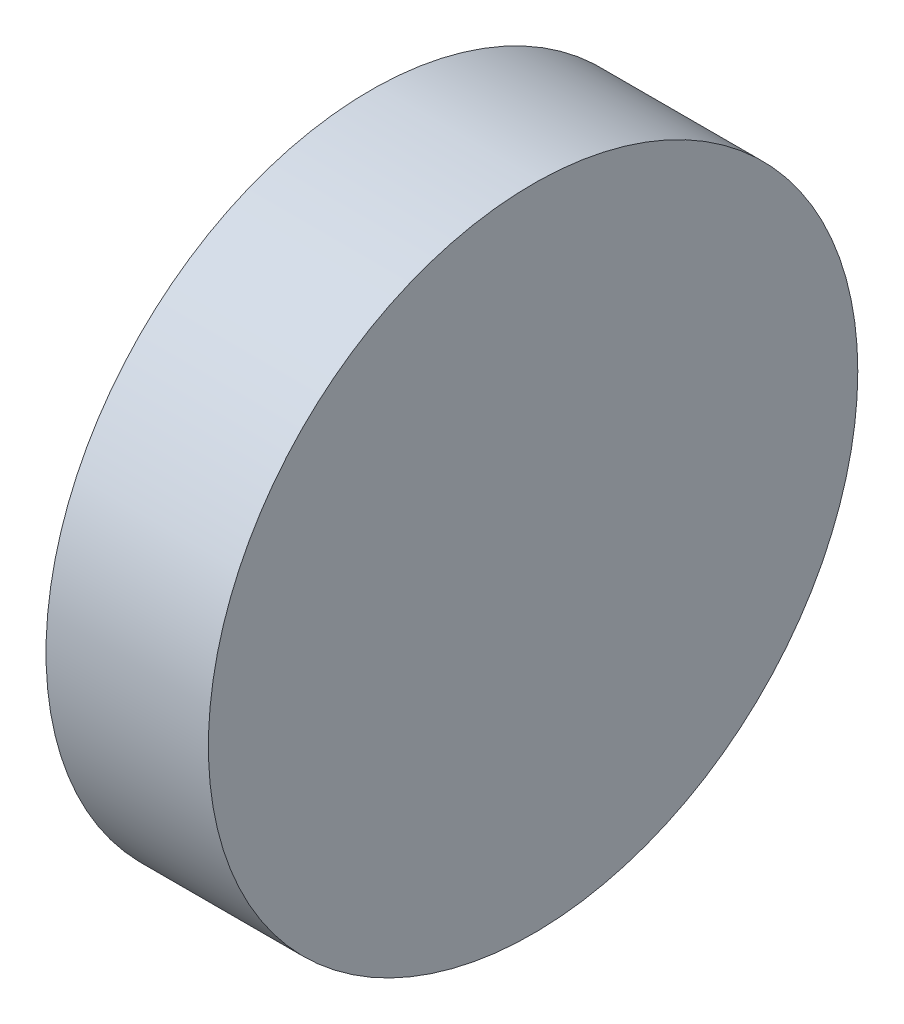
ISO-10303-21;
HEADER;
FILE_DESCRIPTION(('STEP AP214'),'2;1');
FILE_NAME('part.step','',(''),(''),'','','');
FILE_SCHEMA(('AUTOMOTIVE_DESIGN { 1 0 10303 214 1 1 1 1 }'));
ENDSEC;
DATA;
#1=APPLICATION_CONTEXT('core data for automotive mechanical design processes');
#2=APPLICATION_PROTOCOL_DEFINITION('international standard','automotive_design',2000,#1);
#3=PRODUCT_CONTEXT('',#1,'mechanical');
#4=PRODUCT('Part','Part','',(#3));
#5=PRODUCT_RELATED_PRODUCT_CATEGORY('part','',(#4));
#6=PRODUCT_DEFINITION_FORMATION('','',#4);
#7=PRODUCT_DEFINITION_CONTEXT('part definition',#1,'design');
#8=PRODUCT_DEFINITION('design','',#6,#7);
#9=PRODUCT_DEFINITION_SHAPE('','',#8);
#10=(LENGTH_UNIT() NAMED_UNIT(*) SI_UNIT(.MILLI.,.METRE.));
#11=(NAMED_UNIT(*) PLANE_ANGLE_UNIT() SI_UNIT($,.RADIAN.));
#12=(NAMED_UNIT(*) SI_UNIT($,.STERADIAN.) SOLID_ANGLE_UNIT());
#13=UNCERTAINTY_MEASURE_WITH_UNIT(LENGTH_MEASURE(1.E-05),#10,'distance_accuracy_value','');
#14=(GEOMETRIC_REPRESENTATION_CONTEXT(3) GLOBAL_UNCERTAINTY_ASSIGNED_CONTEXT((#13)) GLOBAL_UNIT_ASSIGNED_CONTEXT((#10,
#11,#12)) REPRESENTATION_CONTEXT('',''));
#15=CARTESIAN_POINT('',(0.,0.,0.));
#16=DIRECTION('',(0.,0.,1.));
#17=DIRECTION('',(1.,0.,0.));
#18=AXIS2_PLACEMENT_3D('',#15,#16,#17);
#19=CARTESIAN_POINT('',(100.,1.33644143846823,0.));
#20=DIRECTION('',(-1.,0.,0.));
#21=DIRECTION('',(0.,0.,1.));
#22=AXIS2_PLACEMENT_3D('',#19,#20,#21);
#23=CYLINDRICAL_SURFACE('',#22,200.);
#24=CARTESIAN_POINT('',(100.,1.33644143846823,0.));
#25=DIRECTION('',(1.,0.,0.));
#26=DIRECTION('',(0.,0.,-1.));
#27=AXIS2_PLACEMENT_3D('',#24,#25,#26);
#28=CIRCLE('',#27,200.);
#29=CARTESIAN_POINT('',(100.,1.33644143846823,-200.));
#30=VERTEX_POINT('',#29);
#31=EDGE_CURVE('E10',#30,#30,#28,.T.);
#32=ORIENTED_EDGE('',*,*,#31,.F.);
#33=EDGE_LOOP('',(#32));
#34=FACE_BOUND('',#33,.T.);
#35=CARTESIAN_POINT('',(0.,1.33644143846823,0.));
#36=DIRECTION('',(1.,0.,0.));
#37=DIRECTION('',(0.,0.,-1.));
#38=AXIS2_PLACEMENT_3D('',#35,#36,#37);
#39=CIRCLE('',#38,200.);
#40=CARTESIAN_POINT('',(0.,1.33644143846823,-200.));
#41=VERTEX_POINT('',#40);
#42=EDGE_CURVE('E34',#41,#41,#39,.T.);
#43=ORIENTED_EDGE('',*,*,#42,.T.);
#44=EDGE_LOOP('',(#43));
#45=FACE_BOUND('',#44,.T.);
#46=ADVANCED_FACE('F31',(#34,#45),#23,.T.);
#47=CARTESIAN_POINT('',(100.,1.33644143846823,0.));
#48=DIRECTION('',(1.,0.,0.));
#49=DIRECTION('',(0.,0.,-1.));
#50=AXIS2_PLACEMENT_3D('',#47,#48,#49);
#51=PLANE('',#50);
#52=ORIENTED_EDGE('',*,*,#31,.T.);
#53=EDGE_LOOP('',(#52));
#54=FACE_BOUND('',#53,.T.);
#55=ADVANCED_FACE('F46',(#54),#51,.T.);
#56=CARTESIAN_POINT('',(0.,1.33644143846823,0.));
#57=DIRECTION('',(1.,0.,0.));
#58=DIRECTION('',(0.,0.,-1.));
#59=AXIS2_PLACEMENT_3D('',#56,#57,#58);
#60=PLANE('',#59);
#61=ORIENTED_EDGE('',*,*,#42,.F.);
#62=EDGE_LOOP('',(#61));
#63=FACE_BOUND('',#62,.T.);
#64=ADVANCED_FACE('F44',(#63),#60,.F.);
#65=CLOSED_SHELL('',(#46,#55,#64));
#66=MANIFOLD_SOLID_BREP('B2',#65);
#67=ADVANCED_BREP_SHAPE_REPRESENTATION('',(#18,#66),#14);
#68=SHAPE_DEFINITION_REPRESENTATION(#9,#67);
ENDSEC;
END-ISO-10303-21;
